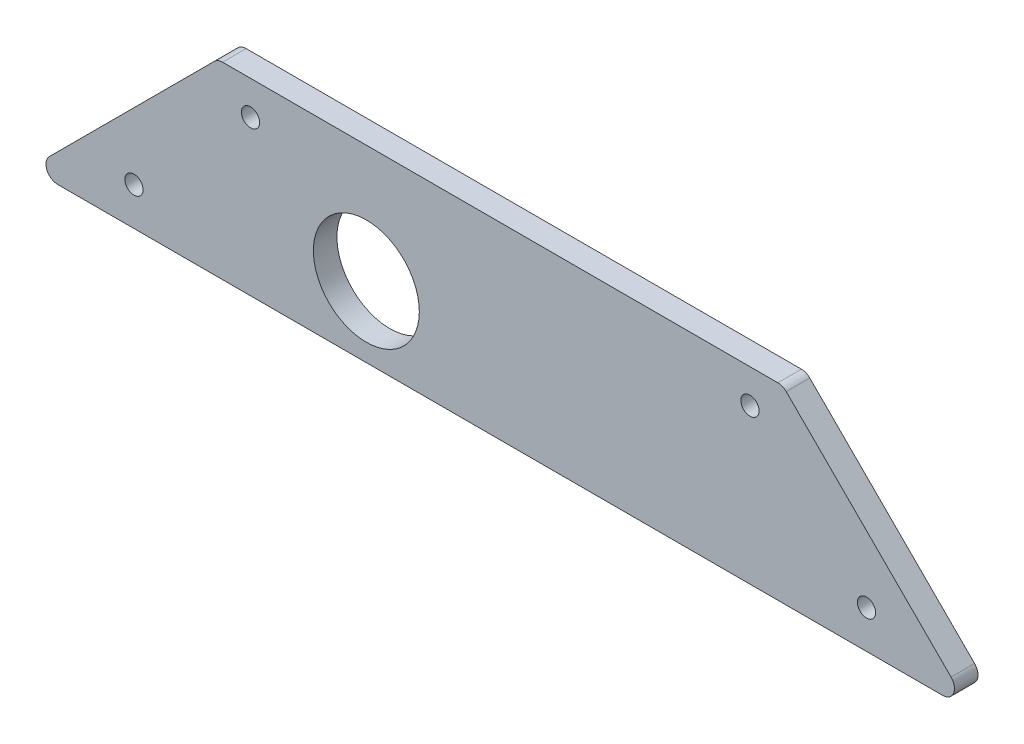
ISO-10303-21;
HEADER;
FILE_DESCRIPTION(('STEP AP214'),'2;1');
FILE_NAME('part.step','',(''),(''),'','','');
FILE_SCHEMA(('AUTOMOTIVE_DESIGN { 1 0 10303 214 1 1 1 1 }'));
ENDSEC;
DATA;
#1=APPLICATION_CONTEXT('core data for automotive mechanical design processes');
#2=APPLICATION_PROTOCOL_DEFINITION('international standard','automotive_design',2000,#1);
#3=PRODUCT_CONTEXT('',#1,'mechanical');
#4=PRODUCT('Part','Part','',(#3));
#5=PRODUCT_RELATED_PRODUCT_CATEGORY('part','',(#4));
#6=PRODUCT_DEFINITION_FORMATION('','',#4);
#7=PRODUCT_DEFINITION_CONTEXT('part definition',#1,'design');
#8=PRODUCT_DEFINITION('design','',#6,#7);
#9=PRODUCT_DEFINITION_SHAPE('','',#8);
#10=(LENGTH_UNIT() NAMED_UNIT(*) SI_UNIT(.MILLI.,.METRE.));
#11=(NAMED_UNIT(*) PLANE_ANGLE_UNIT() SI_UNIT($,.RADIAN.));
#12=(NAMED_UNIT(*) SI_UNIT($,.STERADIAN.) SOLID_ANGLE_UNIT());
#13=UNCERTAINTY_MEASURE_WITH_UNIT(LENGTH_MEASURE(1.E-05),#10,'distance_accuracy_value','');
#14=(GEOMETRIC_REPRESENTATION_CONTEXT(3) GLOBAL_UNCERTAINTY_ASSIGNED_CONTEXT((#13)) GLOBAL_UNIT_ASSIGNED_CONTEXT((#10,
#11,#12)) REPRESENTATION_CONTEXT('',''));
#15=CARTESIAN_POINT('',(0.,0.,0.));
#16=DIRECTION('',(0.,0.,1.));
#17=DIRECTION('',(1.,0.,0.));
#18=AXIS2_PLACEMENT_3D('',#15,#16,#17);
#19=CARTESIAN_POINT('',(-76.1999999999995,29.1621533831808,3.175));
#20=DIRECTION('',(0.,-1.,0.));
#21=DIRECTION('',(1.,0.,0.));
#22=AXIS2_PLACEMENT_3D('',#19,#20,#21);
#23=PLANE('',#22);
#24=DIRECTION('',(-1.,0.,0.));
#25=VECTOR('',#24,1.);
#26=CARTESIAN_POINT('',(-76.1999999999995,29.1621533831808,-3.175));
#27=LINE('',#26,#25);
#28=CARTESIAN_POINT('',(74.8848719394649,29.1621533831808,-3.175));
#29=VERTEX_POINT('',#28);
#30=CARTESIAN_POINT('',(-74.8848719394649,29.1621533831808,-3.175));
#31=VERTEX_POINT('',#30);
#32=EDGE_CURVE('E129',#29,#31,#27,.T.);
#33=ORIENTED_EDGE('',*,*,#32,.T.);
#34=DIRECTION('',(0.,0.,-1.));
#35=VECTOR('',#34,1.);
#36=CARTESIAN_POINT('',(-74.8848719394649,29.1621533831808,3.175));
#37=LINE('',#36,#35);
#38=CARTESIAN_POINT('',(-74.8848719394649,29.1621533831808,3.175));
#39=VERTEX_POINT('',#38);
#40=EDGE_CURVE('E151',#31,#39,#37,.F.);
#41=ORIENTED_EDGE('',*,*,#40,.T.);
#42=DIRECTION('',(-1.,0.,0.));
#43=VECTOR('',#42,1.);
#44=CARTESIAN_POINT('',(-76.1999999999995,29.1621533831808,3.175));
#45=LINE('',#44,#43);
#46=CARTESIAN_POINT('',(74.8848719394649,29.1621533831808,3.175));
#47=VERTEX_POINT('',#46);
#48=EDGE_CURVE('E127',#47,#39,#45,.T.);
#49=ORIENTED_EDGE('',*,*,#48,.F.);
#50=DIRECTION('',(0.,0.,-1.));
#51=VECTOR('',#50,1.);
#52=CARTESIAN_POINT('',(74.8848719394649,29.1621533831808,3.175));
#53=LINE('',#52,#51);
#54=EDGE_CURVE('E148',#47,#29,#53,.T.);
#55=ORIENTED_EDGE('',*,*,#54,.T.);
#56=EDGE_LOOP('',(#33,#41,#49,#55));
#57=FACE_BOUND('',#56,.T.);
#58=ADVANCED_FACE('F32',(#57),#23,.F.);
#59=CARTESIAN_POINT('',(-76.1999999999995,29.1621533831808,3.175));
#60=DIRECTION('',(0.707106781186544,-0.707106781186551,0.));
#61=DIRECTION('',(0.707106781186551,0.707106781186544,0.));
#62=AXIS2_PLACEMENT_3D('',#59,#60,#61);
#63=PLANE('',#62);
#64=DIRECTION('',(-0.707106781186551,-0.707106781186544,0.));
#65=VECTOR('',#64,1.);
#66=CARTESIAN_POINT('',(-76.1999999999995,29.1621533831808,-3.175));
#67=LINE('',#66,#65);
#68=CARTESIAN_POINT('',(-77.1299359697322,28.2322174134481,-3.175));
#69=VERTEX_POINT('',#68);
#70=CARTESIAN_POINT('',(-121.579935969733,-16.2177825865519,-3.175));
#71=VERTEX_POINT('',#70);
#72=EDGE_CURVE('E125',#69,#71,#67,.T.);
#73=ORIENTED_EDGE('',*,*,#72,.T.);
#74=DIRECTION('',(0.,0.,-1.));
#75=VECTOR('',#74,1.);
#76=CARTESIAN_POINT('',(-121.579935969733,-16.2177825865519,3.175));
#77=LINE('',#76,#75);
#78=CARTESIAN_POINT('',(-121.579935969733,-16.2177825865519,3.175));
#79=VERTEX_POINT('',#78);
#80=EDGE_CURVE('E103',#71,#79,#77,.F.);
#81=ORIENTED_EDGE('',*,*,#80,.T.);
#82=DIRECTION('',(-0.707106781186551,-0.707106781186544,0.));
#83=VECTOR('',#82,1.);
#84=CARTESIAN_POINT('',(-76.1999999999995,29.1621533831808,3.175));
#85=LINE('',#84,#83);
#86=CARTESIAN_POINT('',(-77.1299359697322,28.2322174134481,3.175));
#87=VERTEX_POINT('',#86);
#88=EDGE_CURVE('E165',#87,#79,#85,.T.);
#89=ORIENTED_EDGE('',*,*,#88,.F.);
#90=DIRECTION('',(0.,0.,-1.));
#91=VECTOR('',#90,1.);
#92=CARTESIAN_POINT('',(-77.1299359697322,28.2322174134481,3.175));
#93=LINE('',#92,#91);
#94=EDGE_CURVE('E108',#87,#69,#93,.T.);
#95=ORIENTED_EDGE('',*,*,#94,.T.);
#96=EDGE_LOOP('',(#73,#81,#89,#95));
#97=FACE_BOUND('',#96,.T.);
#98=ADVANCED_FACE('F170',(#97),#63,.F.);
#99=CARTESIAN_POINT('',(-127.,-21.6378466168192,3.175));
#100=DIRECTION('',(0.,1.,0.));
#101=DIRECTION('',(0.,0.,1.));
#102=AXIS2_PLACEMENT_3D('',#99,#100,#101);
#103=PLANE('',#102);
#104=DIRECTION('',(1.,0.,0.));
#105=VECTOR('',#104,1.);
#106=CARTESIAN_POINT('',(-127.,-21.6378466168192,3.175));
#107=LINE('',#106,#105);
#108=CARTESIAN_POINT('',(-119.334871939465,-21.6378466168192,3.175));
#109=VERTEX_POINT('',#108);
#110=CARTESIAN_POINT('',(119.334871939465,-21.6378466168192,3.175));
#111=VERTEX_POINT('',#110);
#112=EDGE_CURVE('E117',#109,#111,#107,.T.);
#113=ORIENTED_EDGE('',*,*,#112,.F.);
#114=DIRECTION('',(0.,0.,-1.));
#115=VECTOR('',#114,1.);
#116=CARTESIAN_POINT('',(-119.334871939465,-21.6378466168192,3.175));
#117=LINE('',#116,#115);
#118=CARTESIAN_POINT('',(-119.334871939465,-21.6378466168192,-3.175));
#119=VERTEX_POINT('',#118);
#120=EDGE_CURVE('E102',#109,#119,#117,.T.);
#121=ORIENTED_EDGE('',*,*,#120,.T.);
#122=DIRECTION('',(1.,0.,0.));
#123=VECTOR('',#122,1.);
#124=CARTESIAN_POINT('',(-127.,-21.6378466168192,-3.175));
#125=LINE('',#124,#123);
#126=CARTESIAN_POINT('',(119.334871939465,-21.6378466168192,-3.175));
#127=VERTEX_POINT('',#126);
#128=EDGE_CURVE('E115',#119,#127,#125,.T.);
#129=ORIENTED_EDGE('',*,*,#128,.T.);
#130=DIRECTION('',(0.,0.,-1.));
#131=VECTOR('',#130,1.);
#132=CARTESIAN_POINT('',(119.334871939465,-21.6378466168192,3.175));
#133=LINE('',#132,#131);
#134=EDGE_CURVE('E119',#127,#111,#133,.F.);
#135=ORIENTED_EDGE('',*,*,#134,.T.);
#136=EDGE_LOOP('',(#113,#121,#129,#135));
#137=FACE_BOUND('',#136,.T.);
#138=ADVANCED_FACE('F114',(#137),#103,.F.);
#139=CARTESIAN_POINT('',(127.,-21.6378466168192,3.175));
#140=DIRECTION('',(-0.707106781186543,-0.707106781186552,0.));
#141=DIRECTION('',(0.707106781186552,-0.707106781186543,0.));
#142=AXIS2_PLACEMENT_3D('',#139,#140,#141);
#143=PLANE('',#142);
#144=DIRECTION('',(-0.707106781186552,0.707106781186543,0.));
#145=VECTOR('',#144,1.);
#146=CARTESIAN_POINT('',(127.,-21.6378466168192,3.175));
#147=LINE('',#146,#145);
#148=CARTESIAN_POINT('',(121.579935969733,-16.2177825865519,3.175));
#149=VERTEX_POINT('',#148);
#150=CARTESIAN_POINT('',(77.1299359697321,28.2322174134481,3.175));
#151=VERTEX_POINT('',#150);
#152=EDGE_CURVE('E133',#149,#151,#147,.T.);
#153=ORIENTED_EDGE('',*,*,#152,.F.);
#154=DIRECTION('',(0.,0.,-1.));
#155=VECTOR('',#154,1.);
#156=CARTESIAN_POINT('',(121.579935969733,-16.2177825865519,3.175));
#157=LINE('',#156,#155);
#158=CARTESIAN_POINT('',(121.579935969733,-16.2177825865519,-3.175));
#159=VERTEX_POINT('',#158);
#160=EDGE_CURVE('E11',#149,#159,#157,.T.);
#161=ORIENTED_EDGE('',*,*,#160,.T.);
#162=DIRECTION('',(-0.707106781186552,0.707106781186543,0.));
#163=VECTOR('',#162,1.);
#164=CARTESIAN_POINT('',(127.,-21.6378466168192,-3.175));
#165=LINE('',#164,#163);
#166=CARTESIAN_POINT('',(77.1299359697321,28.2322174134481,-3.175));
#167=VERTEX_POINT('',#166);
#168=EDGE_CURVE('E124',#159,#167,#165,.T.);
#169=ORIENTED_EDGE('',*,*,#168,.T.);
#170=DIRECTION('',(0.,0.,-1.));
#171=VECTOR('',#170,1.);
#172=CARTESIAN_POINT('',(77.1299359697321,28.2322174134481,3.175));
#173=LINE('',#172,#171);
#174=EDGE_CURVE('E40',#167,#151,#173,.F.);
#175=ORIENTED_EDGE('',*,*,#174,.T.);
#176=EDGE_LOOP('',(#153,#161,#169,#175));
#177=FACE_BOUND('',#176,.T.);
#178=ADVANCED_FACE('F210',(#177),#143,.F.);
#179=CARTESIAN_POINT('',(0.,0.,3.175));
#180=DIRECTION('',(0.,0.,1.));
#181=DIRECTION('',(1.,0.,0.));
#182=AXIS2_PLACEMENT_3D('',#179,#180,#181);
#183=PLANE('',#182);
#184=CARTESIAN_POINT('',(67.3519209080186,20.0497202330234,3.175));
#185=DIRECTION('',(0.,0.,1.));
#186=DIRECTION('',(1.,0.,0.));
#187=AXIS2_PLACEMENT_3D('',#184,#185,#186);
#188=CIRCLE('',#187,2.45744999999999);
#189=CARTESIAN_POINT('',(69.8093709080186,20.0497202330234,3.175));
#190=VERTEX_POINT('',#189);
#191=EDGE_CURVE('E202',#190,#190,#188,.T.);
#192=ORIENTED_EDGE('',*,*,#191,.F.);
#193=EDGE_LOOP('',(#192));
#194=FACE_BOUND('',#193,.T.);
#195=CARTESIAN_POINT('',(98.7828173317607,-11.3811761907187,3.175));
#196=DIRECTION('',(0.,0.,1.));
#197=DIRECTION('',(1.,0.,0.));
#198=AXIS2_PLACEMENT_3D('',#195,#196,#197);
#199=CIRCLE('',#198,2.45744999999999);
#200=CARTESIAN_POINT('',(101.240267331761,-11.3811761907187,3.175));
#201=VERTEX_POINT('',#200);
#202=EDGE_CURVE('E196',#201,#201,#199,.T.);
#203=ORIENTED_EDGE('',*,*,#202,.F.);
#204=EDGE_LOOP('',(#203));
#205=FACE_BOUND('',#204,.T.);
#206=CARTESIAN_POINT('',(-67.3519209080187,20.0497202330234,3.175));
#207=DIRECTION('',(0.,0.,1.));
#208=DIRECTION('',(1.,0.,0.));
#209=AXIS2_PLACEMENT_3D('',#206,#207,#208);
#210=CIRCLE('',#209,2.45744999999999);
#211=CARTESIAN_POINT('',(-64.8944709080187,20.0497202330234,3.175));
#212=VERTEX_POINT('',#211);
#213=EDGE_CURVE('E190',#212,#212,#210,.T.);
#214=ORIENTED_EDGE('',*,*,#213,.F.);
#215=EDGE_LOOP('',(#214));
#216=FACE_BOUND('',#215,.T.);
#217=CARTESIAN_POINT('',(-98.7828173317607,-11.3811761907187,3.175));
#218=DIRECTION('',(0.,0.,1.));
#219=DIRECTION('',(1.,0.,0.));
#220=AXIS2_PLACEMENT_3D('',#217,#218,#219);
#221=CIRCLE('',#220,2.45744999999999);
#222=CARTESIAN_POINT('',(-96.3253673317607,-11.3811761907187,3.175));
#223=VERTEX_POINT('',#222);
#224=EDGE_CURVE('E184',#223,#223,#221,.T.);
#225=ORIENTED_EDGE('',*,*,#224,.F.);
#226=EDGE_LOOP('',(#225));
#227=FACE_BOUND('',#226,.T.);
#228=CARTESIAN_POINT('',(-36.1079510314463,-2.58784661681916,3.175));
#229=DIRECTION('',(0.,0.,1.));
#230=DIRECTION('',(1.,0.,0.));
#231=AXIS2_PLACEMENT_3D('',#228,#229,#230);
#232=CIRCLE('',#231,14.2875);
#233=CARTESIAN_POINT('',(-21.8204510314463,-2.58784661681916,3.175));
#234=VERTEX_POINT('',#233);
#235=EDGE_CURVE('E173',#234,#234,#232,.T.);
#236=ORIENTED_EDGE('',*,*,#235,.F.);
#237=EDGE_LOOP('',(#236));
#238=FACE_BOUND('',#237,.T.);
#239=ORIENTED_EDGE('',*,*,#88,.T.);
#240=CARTESIAN_POINT('',(-119.334871939465,-18.4628466168192,3.175));
#241=DIRECTION('',(0.,0.,1.));
#242=DIRECTION('',(1.,0.,0.));
#243=AXIS2_PLACEMENT_3D('',#240,#241,#242);
#244=CIRCLE('',#243,3.175);
#245=EDGE_CURVE('E146',#79,#109,#244,.T.);
#246=ORIENTED_EDGE('',*,*,#245,.T.);
#247=ORIENTED_EDGE('',*,*,#112,.T.);
#248=CARTESIAN_POINT('',(119.334871939465,-18.4628466168192,3.175));
#249=DIRECTION('',(0.,0.,1.));
#250=DIRECTION('',(1.,0.,0.));
#251=AXIS2_PLACEMENT_3D('',#248,#249,#250);
#252=CIRCLE('',#251,3.175);
#253=EDGE_CURVE('E53',#111,#149,#252,.T.);
#254=ORIENTED_EDGE('',*,*,#253,.T.);
#255=ORIENTED_EDGE('',*,*,#152,.T.);
#256=CARTESIAN_POINT('',(74.8848719394649,25.9871533831808,3.175));
#257=DIRECTION('',(0.,0.,1.));
#258=DIRECTION('',(1.,0.,0.));
#259=AXIS2_PLACEMENT_3D('',#256,#257,#258);
#260=CIRCLE('',#259,3.175);
#261=EDGE_CURVE('E141',#151,#47,#260,.T.);
#262=ORIENTED_EDGE('',*,*,#261,.T.);
#263=ORIENTED_EDGE('',*,*,#48,.T.);
#264=CARTESIAN_POINT('',(-74.8848719394649,25.9871533831808,3.175));
#265=DIRECTION('',(0.,0.,1.));
#266=DIRECTION('',(1.,0.,0.));
#267=AXIS2_PLACEMENT_3D('',#264,#265,#266);
#268=CIRCLE('',#267,3.175);
#269=EDGE_CURVE('E144',#39,#87,#268,.T.);
#270=ORIENTED_EDGE('',*,*,#269,.T.);
#271=EDGE_LOOP('',(#239,#246,#247,#254,#255,#262,#263,#270));
#272=FACE_BOUND('',#271,.T.);
#273=ADVANCED_FACE('F162',(#194,#205,#216,#227,#238,#272),#183,.T.);
#274=CARTESIAN_POINT('',(0.,0.,-3.175));
#275=DIRECTION('',(0.,0.,1.));
#276=DIRECTION('',(1.,0.,0.));
#277=AXIS2_PLACEMENT_3D('',#274,#275,#276);
#278=PLANE('',#277);
#279=CARTESIAN_POINT('',(67.3519209080186,20.0497202330234,-3.17499999999999));
#280=DIRECTION('',(0.,0.,1.));
#281=DIRECTION('',(1.,0.,0.));
#282=AXIS2_PLACEMENT_3D('',#279,#280,#281);
#283=CIRCLE('',#282,2.45744999999999);
#284=CARTESIAN_POINT('',(69.8093709080186,20.0497202330234,-3.17499999999999));
#285=VERTEX_POINT('',#284);
#286=EDGE_CURVE('E199',#285,#285,#283,.T.);
#287=ORIENTED_EDGE('',*,*,#286,.T.);
#288=EDGE_LOOP('',(#287));
#289=FACE_BOUND('',#288,.T.);
#290=CARTESIAN_POINT('',(98.7828173317607,-11.3811761907187,-3.17499999999999));
#291=DIRECTION('',(0.,0.,1.));
#292=DIRECTION('',(1.,0.,0.));
#293=AXIS2_PLACEMENT_3D('',#290,#291,#292);
#294=CIRCLE('',#293,2.45744999999999);
#295=CARTESIAN_POINT('',(101.240267331761,-11.3811761907187,-3.17499999999999));
#296=VERTEX_POINT('',#295);
#297=EDGE_CURVE('E193',#296,#296,#294,.T.);
#298=ORIENTED_EDGE('',*,*,#297,.T.);
#299=EDGE_LOOP('',(#298));
#300=FACE_BOUND('',#299,.T.);
#301=CARTESIAN_POINT('',(-67.3519209080187,20.0497202330234,-3.17499999999999));
#302=DIRECTION('',(0.,0.,1.));
#303=DIRECTION('',(1.,0.,0.));
#304=AXIS2_PLACEMENT_3D('',#301,#302,#303);
#305=CIRCLE('',#304,2.45744999999999);
#306=CARTESIAN_POINT('',(-64.8944709080187,20.0497202330234,-3.17499999999999));
#307=VERTEX_POINT('',#306);
#308=EDGE_CURVE('E187',#307,#307,#305,.T.);
#309=ORIENTED_EDGE('',*,*,#308,.T.);
#310=EDGE_LOOP('',(#309));
#311=FACE_BOUND('',#310,.T.);
#312=CARTESIAN_POINT('',(-98.7828173317607,-11.3811761907187,-3.17499999999999));
#313=DIRECTION('',(0.,0.,1.));
#314=DIRECTION('',(1.,0.,0.));
#315=AXIS2_PLACEMENT_3D('',#312,#313,#314);
#316=CIRCLE('',#315,2.45744999999999);
#317=CARTESIAN_POINT('',(-96.3253673317607,-11.3811761907187,-3.17499999999999));
#318=VERTEX_POINT('',#317);
#319=EDGE_CURVE('E180',#318,#318,#316,.T.);
#320=ORIENTED_EDGE('',*,*,#319,.T.);
#321=EDGE_LOOP('',(#320));
#322=FACE_BOUND('',#321,.T.);
#323=CARTESIAN_POINT('',(-36.1079510314463,-2.58784661681916,-3.175));
#324=DIRECTION('',(0.,0.,1.));
#325=DIRECTION('',(1.,0.,0.));
#326=AXIS2_PLACEMENT_3D('',#323,#324,#325);
#327=CIRCLE('',#326,14.2875);
#328=CARTESIAN_POINT('',(-21.8204510314463,-2.58784661681916,-3.175));
#329=VERTEX_POINT('',#328);
#330=EDGE_CURVE('E171',#329,#329,#327,.T.);
#331=ORIENTED_EDGE('',*,*,#330,.T.);
#332=EDGE_LOOP('',(#331));
#333=FACE_BOUND('',#332,.T.);
#334=ORIENTED_EDGE('',*,*,#128,.F.);
#335=CARTESIAN_POINT('',(-119.334871939465,-18.4628466168192,-3.175));
#336=DIRECTION('',(0.,0.,1.));
#337=DIRECTION('',(1.,0.,0.));
#338=AXIS2_PLACEMENT_3D('',#335,#336,#337);
#339=CIRCLE('',#338,3.175);
#340=EDGE_CURVE('E98',#119,#71,#339,.F.);
#341=ORIENTED_EDGE('',*,*,#340,.T.);
#342=ORIENTED_EDGE('',*,*,#72,.F.);
#343=CARTESIAN_POINT('',(-74.8848719394649,25.9871533831808,-3.175));
#344=DIRECTION('',(0.,0.,1.));
#345=DIRECTION('',(1.,0.,0.));
#346=AXIS2_PLACEMENT_3D('',#343,#344,#345);
#347=CIRCLE('',#346,3.175);
#348=EDGE_CURVE('E109',#69,#31,#347,.F.);
#349=ORIENTED_EDGE('',*,*,#348,.T.);
#350=ORIENTED_EDGE('',*,*,#32,.F.);
#351=CARTESIAN_POINT('',(74.8848719394649,25.9871533831808,-3.175));
#352=DIRECTION('',(0.,0.,1.));
#353=DIRECTION('',(1.,0.,0.));
#354=AXIS2_PLACEMENT_3D('',#351,#352,#353);
#355=CIRCLE('',#354,3.175);
#356=EDGE_CURVE('E118',#29,#167,#355,.F.);
#357=ORIENTED_EDGE('',*,*,#356,.T.);
#358=ORIENTED_EDGE('',*,*,#168,.F.);
#359=CARTESIAN_POINT('',(119.334871939465,-18.4628466168192,-3.175));
#360=DIRECTION('',(0.,0.,1.));
#361=DIRECTION('',(1.,0.,0.));
#362=AXIS2_PLACEMENT_3D('',#359,#360,#361);
#363=CIRCLE('',#362,3.175);
#364=EDGE_CURVE('E123',#159,#127,#363,.F.);
#365=ORIENTED_EDGE('',*,*,#364,.T.);
#366=EDGE_LOOP('',(#334,#341,#342,#349,#350,#357,#358,#365));
#367=FACE_BOUND('',#366,.T.);
#368=ADVANCED_FACE('F121',(#289,#300,#311,#322,#333,#367),#278,.F.);
#369=CARTESIAN_POINT('',(-36.1079510314463,-2.58784661681916,-3.175));
#370=DIRECTION('',(0.,0.,1.));
#371=DIRECTION('',(1.,0.,0.));
#372=AXIS2_PLACEMENT_3D('',#369,#370,#371);
#373=CYLINDRICAL_SURFACE('',#372,14.2875);
#374=ORIENTED_EDGE('',*,*,#330,.F.);
#375=EDGE_LOOP('',(#374));
#376=FACE_BOUND('',#375,.T.);
#377=ORIENTED_EDGE('',*,*,#235,.T.);
#378=EDGE_LOOP('',(#377));
#379=FACE_BOUND('',#378,.T.);
#380=ADVANCED_FACE('F220',(#376,#379),#373,.F.);
#381=CARTESIAN_POINT('',(-98.7828173317607,-11.3811761907187,3.175));
#382=DIRECTION('',(0.,0.,1.));
#383=DIRECTION('',(1.,0.,0.));
#384=AXIS2_PLACEMENT_3D('',#381,#382,#383);
#385=CYLINDRICAL_SURFACE('',#384,2.45744999999999);
#386=ORIENTED_EDGE('',*,*,#319,.F.);
#387=EDGE_LOOP('',(#386));
#388=FACE_BOUND('',#387,.T.);
#389=ORIENTED_EDGE('',*,*,#224,.T.);
#390=EDGE_LOOP('',(#389));
#391=FACE_BOUND('',#390,.T.);
#392=ADVANCED_FACE('F222',(#388,#391),#385,.F.);
#393=CARTESIAN_POINT('',(-67.3519209080187,20.0497202330234,3.175));
#394=DIRECTION('',(0.,0.,1.));
#395=DIRECTION('',(1.,0.,0.));
#396=AXIS2_PLACEMENT_3D('',#393,#394,#395);
#397=CYLINDRICAL_SURFACE('',#396,2.45744999999999);
#398=ORIENTED_EDGE('',*,*,#308,.F.);
#399=EDGE_LOOP('',(#398));
#400=FACE_BOUND('',#399,.T.);
#401=ORIENTED_EDGE('',*,*,#213,.T.);
#402=EDGE_LOOP('',(#401));
#403=FACE_BOUND('',#402,.T.);
#404=ADVANCED_FACE('F229',(#400,#403),#397,.F.);
#405=CARTESIAN_POINT('',(98.7828173317607,-11.3811761907187,3.175));
#406=DIRECTION('',(0.,0.,1.));
#407=DIRECTION('',(1.,0.,0.));
#408=AXIS2_PLACEMENT_3D('',#405,#406,#407);
#409=CYLINDRICAL_SURFACE('',#408,2.45744999999999);
#410=ORIENTED_EDGE('',*,*,#297,.F.);
#411=EDGE_LOOP('',(#410));
#412=FACE_BOUND('',#411,.T.);
#413=ORIENTED_EDGE('',*,*,#202,.T.);
#414=EDGE_LOOP('',(#413));
#415=FACE_BOUND('',#414,.T.);
#416=ADVANCED_FACE('F305',(#412,#415),#409,.F.);
#417=CARTESIAN_POINT('',(67.3519209080186,20.0497202330234,3.175));
#418=DIRECTION('',(0.,0.,1.));
#419=DIRECTION('',(1.,0.,0.));
#420=AXIS2_PLACEMENT_3D('',#417,#418,#419);
#421=CYLINDRICAL_SURFACE('',#420,2.45744999999999);
#422=ORIENTED_EDGE('',*,*,#286,.F.);
#423=EDGE_LOOP('',(#422));
#424=FACE_BOUND('',#423,.T.);
#425=ORIENTED_EDGE('',*,*,#191,.T.);
#426=EDGE_LOOP('',(#425));
#427=FACE_BOUND('',#426,.T.);
#428=ADVANCED_FACE('F206',(#424,#427),#421,.F.);
#429=CARTESIAN_POINT('',(-119.334871939465,-18.4628466168192,3.175));
#430=DIRECTION('',(0.,0.,-1.));
#431=DIRECTION('',(-1.,0.,0.));
#432=AXIS2_PLACEMENT_3D('',#429,#430,#431);
#433=CYLINDRICAL_SURFACE('',#432,3.175);
#434=ORIENTED_EDGE('',*,*,#245,.F.);
#435=ORIENTED_EDGE('',*,*,#80,.F.);
#436=ORIENTED_EDGE('',*,*,#340,.F.);
#437=ORIENTED_EDGE('',*,*,#120,.F.);
#438=EDGE_LOOP('',(#434,#435,#436,#437));
#439=FACE_BOUND('',#438,.T.);
#440=ADVANCED_FACE('F101',(#439),#433,.T.);
#441=CARTESIAN_POINT('',(-74.8848719394649,25.9871533831808,3.175));
#442=DIRECTION('',(0.,0.,-1.));
#443=DIRECTION('',(-1.,0.,0.));
#444=AXIS2_PLACEMENT_3D('',#441,#442,#443);
#445=CYLINDRICAL_SURFACE('',#444,3.175);
#446=ORIENTED_EDGE('',*,*,#269,.F.);
#447=ORIENTED_EDGE('',*,*,#40,.F.);
#448=ORIENTED_EDGE('',*,*,#348,.F.);
#449=ORIENTED_EDGE('',*,*,#94,.F.);
#450=EDGE_LOOP('',(#446,#447,#448,#449));
#451=FACE_BOUND('',#450,.T.);
#452=ADVANCED_FACE('F168',(#451),#445,.T.);
#453=CARTESIAN_POINT('',(119.334871939465,-18.4628466168192,3.175));
#454=DIRECTION('',(0.,0.,-1.));
#455=DIRECTION('',(-1.,0.,0.));
#456=AXIS2_PLACEMENT_3D('',#453,#454,#455);
#457=CYLINDRICAL_SURFACE('',#456,3.175);
#458=ORIENTED_EDGE('',*,*,#253,.F.);
#459=ORIENTED_EDGE('',*,*,#134,.F.);
#460=ORIENTED_EDGE('',*,*,#364,.F.);
#461=ORIENTED_EDGE('',*,*,#160,.F.);
#462=EDGE_LOOP('',(#458,#459,#460,#461));
#463=FACE_BOUND('',#462,.T.);
#464=ADVANCED_FACE('F248',(#463),#457,.T.);
#465=CARTESIAN_POINT('',(74.8848719394649,25.9871533831808,3.175));
#466=DIRECTION('',(0.,0.,-1.));
#467=DIRECTION('',(-1.,0.,0.));
#468=AXIS2_PLACEMENT_3D('',#465,#466,#467);
#469=CYLINDRICAL_SURFACE('',#468,3.175);
#470=ORIENTED_EDGE('',*,*,#261,.F.);
#471=ORIENTED_EDGE('',*,*,#174,.F.);
#472=ORIENTED_EDGE('',*,*,#356,.F.);
#473=ORIENTED_EDGE('',*,*,#54,.F.);
#474=EDGE_LOOP('',(#470,#471,#472,#473));
#475=FACE_BOUND('',#474,.T.);
#476=ADVANCED_FACE('F34',(#475),#469,.T.);
#477=CLOSED_SHELL('',(#58,#98,#138,#178,#273,#368,#380,#392,#404,#416,#428,#440,#452,#464,#476));
#478=MANIFOLD_SOLID_BREP('B2',#477);
#479=ADVANCED_BREP_SHAPE_REPRESENTATION('',(#18,#478),#14);
#480=SHAPE_DEFINITION_REPRESENTATION(#9,#479);
ENDSEC;
END-ISO-10303-21;
